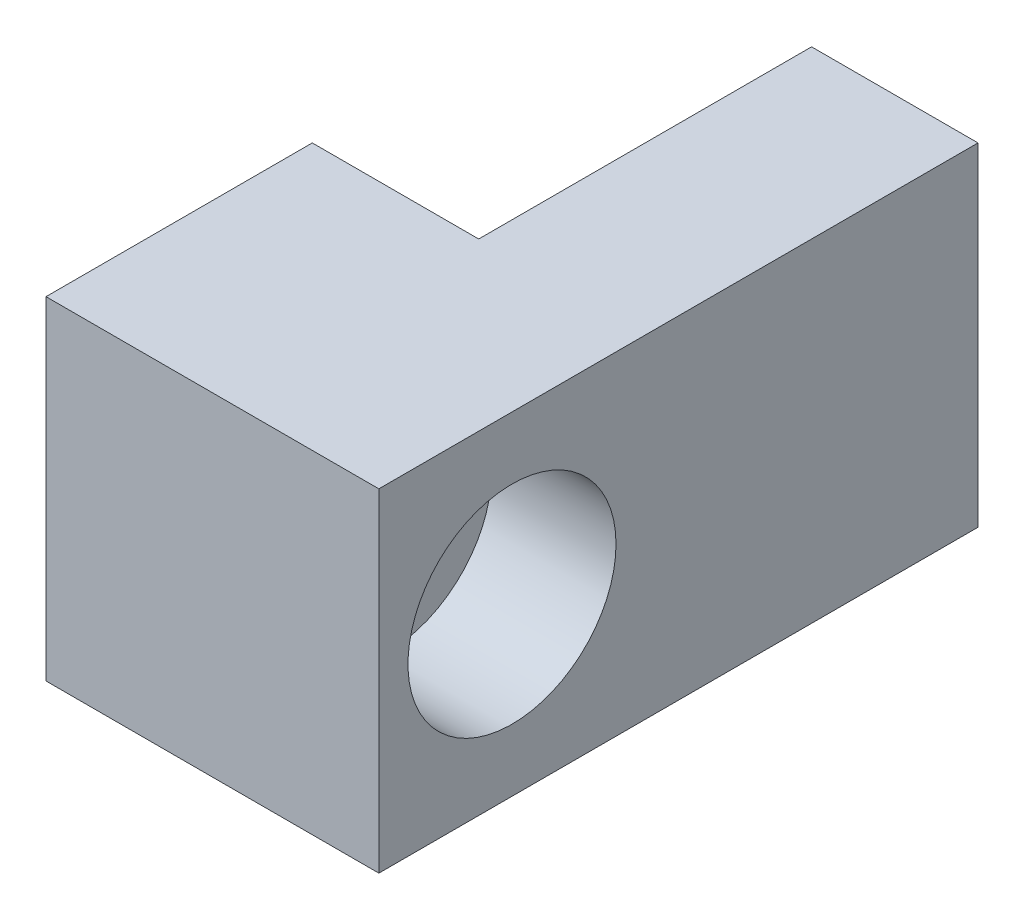
ISO-10303-21;
HEADER;
FILE_DESCRIPTION(('STEP AP214'),'2;1');
FILE_NAME('part.step','',(''),(''),'','','');
FILE_SCHEMA(('AUTOMOTIVE_DESIGN { 1 0 10303 214 1 1 1 1 }'));
ENDSEC;
DATA;
#1=APPLICATION_CONTEXT('core data for automotive mechanical design processes');
#2=APPLICATION_PROTOCOL_DEFINITION('international standard','automotive_design',2000,#1);
#3=PRODUCT_CONTEXT('',#1,'mechanical');
#4=PRODUCT('Part','Part','',(#3));
#5=PRODUCT_RELATED_PRODUCT_CATEGORY('part','',(#4));
#6=PRODUCT_DEFINITION_FORMATION('','',#4);
#7=PRODUCT_DEFINITION_CONTEXT('part definition',#1,'design');
#8=PRODUCT_DEFINITION('design','',#6,#7);
#9=PRODUCT_DEFINITION_SHAPE('','',#8);
#10=(LENGTH_UNIT() NAMED_UNIT(*) SI_UNIT(.MILLI.,.METRE.));
#11=(NAMED_UNIT(*) PLANE_ANGLE_UNIT() SI_UNIT($,.RADIAN.));
#12=(NAMED_UNIT(*) SI_UNIT($,.STERADIAN.) SOLID_ANGLE_UNIT());
#13=UNCERTAINTY_MEASURE_WITH_UNIT(LENGTH_MEASURE(1.E-05),#10,'distance_accuracy_value','');
#14=(GEOMETRIC_REPRESENTATION_CONTEXT(3) GLOBAL_UNCERTAINTY_ASSIGNED_CONTEXT((#13)) GLOBAL_UNIT_ASSIGNED_CONTEXT((#10,
#11,#12)) REPRESENTATION_CONTEXT('',''));
#15=CARTESIAN_POINT('',(0.,0.,0.));
#16=DIRECTION('',(0.,0.,1.));
#17=DIRECTION('',(1.,0.,0.));
#18=AXIS2_PLACEMENT_3D('',#15,#16,#17);
#19=CARTESIAN_POINT('',(3.175,-6.35,6.35));
#20=DIRECTION('',(-1.,0.,0.));
#21=DIRECTION('',(0.,0.,1.));
#22=AXIS2_PLACEMENT_3D('',#19,#20,#21);
#23=PLANE('',#22);
#24=CARTESIAN_POINT('',(3.175,0.,11.43));
#25=DIRECTION('',(1.,0.,0.));
#26=DIRECTION('',(0.,0.,-1.));
#27=AXIS2_PLACEMENT_3D('',#24,#25,#26);
#28=CIRCLE('',#27,3.96875);
#29=CARTESIAN_POINT('',(3.175,0.,7.46125));
#30=VERTEX_POINT('',#29);
#31=EDGE_CURVE('E228',#30,#30,#28,.T.);
#32=ORIENTED_EDGE('',*,*,#31,.F.);
#33=EDGE_LOOP('',(#32));
#34=FACE_BOUND('',#33,.T.);
#35=DIRECTION('',(0.,1.,0.));
#36=VECTOR('',#35,1.);
#37=CARTESIAN_POINT('',(3.175,-6.35,-6.35));
#38=LINE('',#37,#36);
#39=CARTESIAN_POINT('',(3.175,-6.35,-6.35));
#40=VERTEX_POINT('',#39);
#41=CARTESIAN_POINT('',(3.175,6.35,-6.35));
#42=VERTEX_POINT('',#41);
#43=EDGE_CURVE('E116',#40,#42,#38,.T.);
#44=ORIENTED_EDGE('',*,*,#43,.T.);
#45=DIRECTION('',(0.,0.,-1.));
#46=VECTOR('',#45,1.);
#47=CARTESIAN_POINT('',(3.175,6.35,6.35));
#48=LINE('',#47,#46);
#49=CARTESIAN_POINT('',(3.175,6.35,16.51));
#50=VERTEX_POINT('',#49);
#51=EDGE_CURVE('E11',#50,#42,#48,.T.);
#52=ORIENTED_EDGE('',*,*,#51,.F.);
#53=DIRECTION('',(0.,1.,0.));
#54=VECTOR('',#53,1.);
#55=CARTESIAN_POINT('',(3.175,-6.35,16.51));
#56=LINE('',#55,#54);
#57=CARTESIAN_POINT('',(3.175,-6.35,16.51));
#58=VERTEX_POINT('',#57);
#59=EDGE_CURVE('E114',#58,#50,#56,.T.);
#60=ORIENTED_EDGE('',*,*,#59,.F.);
#61=DIRECTION('',(0.,0.,-1.));
#62=VECTOR('',#61,1.);
#63=CARTESIAN_POINT('',(3.175,-6.35,6.35));
#64=LINE('',#63,#62);
#65=EDGE_CURVE('E169',#58,#40,#64,.T.);
#66=ORIENTED_EDGE('',*,*,#65,.T.);
#67=EDGE_LOOP('',(#44,#52,#60,#66));
#68=FACE_BOUND('',#67,.T.);
#69=ADVANCED_FACE('F39',(#34,#68),#23,.F.);
#70=CARTESIAN_POINT('',(-3.175,6.35,6.35));
#71=DIRECTION('',(0.,-1.,0.));
#72=DIRECTION('',(0.,0.,-1.));
#73=AXIS2_PLACEMENT_3D('',#70,#71,#72);
#74=PLANE('',#73);
#75=DIRECTION('',(-1.,0.,0.));
#76=VECTOR('',#75,1.);
#77=CARTESIAN_POINT('',(-3.175,6.35,-6.35));
#78=LINE('',#77,#76);
#79=CARTESIAN_POINT('',(-3.175,6.35,-6.35));
#80=VERTEX_POINT('',#79);
#81=EDGE_CURVE('E172',#42,#80,#78,.T.);
#82=ORIENTED_EDGE('',*,*,#81,.T.);
#83=DIRECTION('',(0.,0.,-1.));
#84=VECTOR('',#83,1.);
#85=CARTESIAN_POINT('',(-3.175,6.35,6.35));
#86=LINE('',#85,#84);
#87=CARTESIAN_POINT('',(-3.175,6.35,6.35));
#88=VERTEX_POINT('',#87);
#89=EDGE_CURVE('E48',#88,#80,#86,.T.);
#90=ORIENTED_EDGE('',*,*,#89,.F.);
#91=DIRECTION('',(-1.,0.,0.));
#92=VECTOR('',#91,1.);
#93=CARTESIAN_POINT('',(3.175,6.35,6.35));
#94=LINE('',#93,#92);
#95=CARTESIAN_POINT('',(-9.525,6.35,6.35));
#96=VERTEX_POINT('',#95);
#97=EDGE_CURVE('E147',#88,#96,#94,.T.);
#98=ORIENTED_EDGE('',*,*,#97,.T.);
#99=DIRECTION('',(0.,0.,-1.));
#100=VECTOR('',#99,1.);
#101=CARTESIAN_POINT('',(-9.525,6.35,16.51));
#102=LINE('',#101,#100);
#103=CARTESIAN_POINT('',(-9.525,6.35,16.51));
#104=VERTEX_POINT('',#103);
#105=EDGE_CURVE('E121',#104,#96,#102,.T.);
#106=ORIENTED_EDGE('',*,*,#105,.F.);
#107=DIRECTION('',(-1.,0.,0.));
#108=VECTOR('',#107,1.);
#109=CARTESIAN_POINT('',(3.175,6.35,16.51));
#110=LINE('',#109,#108);
#111=EDGE_CURVE('E118',#50,#104,#110,.T.);
#112=ORIENTED_EDGE('',*,*,#111,.F.);
#113=ORIENTED_EDGE('',*,*,#51,.T.);
#114=EDGE_LOOP('',(#82,#90,#98,#106,#112,#113));
#115=FACE_BOUND('',#114,.T.);
#116=ADVANCED_FACE('F119',(#115),#74,.F.);
#117=CARTESIAN_POINT('',(-3.175,4.7625,6.35));
#118=DIRECTION('',(1.,0.,0.));
#119=DIRECTION('',(0.,0.,-1.));
#120=AXIS2_PLACEMENT_3D('',#117,#118,#119);
#121=PLANE('',#120);
#122=DIRECTION('',(0.,-1.,0.));
#123=VECTOR('',#122,1.);
#124=CARTESIAN_POINT('',(-3.175,4.7625,-6.35));
#125=LINE('',#124,#123);
#126=CARTESIAN_POINT('',(-3.175,4.7625,-6.35));
#127=VERTEX_POINT('',#126);
#128=EDGE_CURVE('E175',#80,#127,#125,.T.);
#129=ORIENTED_EDGE('',*,*,#128,.T.);
#130=DIRECTION('',(0.,0.,-1.));
#131=VECTOR('',#130,1.);
#132=CARTESIAN_POINT('',(-3.175,4.7625,6.35));
#133=LINE('',#132,#131);
#134=CARTESIAN_POINT('',(-3.175,4.7625,6.35));
#135=VERTEX_POINT('',#134);
#136=EDGE_CURVE('E192',#135,#127,#133,.T.);
#137=ORIENTED_EDGE('',*,*,#136,.F.);
#138=DIRECTION('',(0.,-1.,0.));
#139=VECTOR('',#138,1.);
#140=CARTESIAN_POINT('',(-3.175,4.7625,6.35));
#141=LINE('',#140,#139);
#142=EDGE_CURVE('E157',#88,#135,#141,.T.);
#143=ORIENTED_EDGE('',*,*,#142,.F.);
#144=ORIENTED_EDGE('',*,*,#89,.T.);
#145=EDGE_LOOP('',(#129,#137,#143,#144));
#146=FACE_BOUND('',#145,.T.);
#147=ADVANCED_FACE('F198',(#146),#121,.F.);
#148=CARTESIAN_POINT('',(-3.175,0.,6.35));
#149=DIRECTION('',(0.,0.,-1.));
#150=DIRECTION('',(-1.,0.,0.));
#151=AXIS2_PLACEMENT_3D('',#148,#149,#150);
#152=CYLINDRICAL_SURFACE('',#151,4.7625);
#153=CARTESIAN_POINT('',(-3.175,0.,-6.35));
#154=DIRECTION('',(0.,0.,-1.));
#155=DIRECTION('',(1.,0.,0.));
#156=AXIS2_PLACEMENT_3D('',#153,#154,#155);
#157=CIRCLE('',#156,4.7625);
#158=CARTESIAN_POINT('',(-3.175,-4.7625,-6.35));
#159=VERTEX_POINT('',#158);
#160=EDGE_CURVE('E178',#127,#159,#157,.T.);
#161=ORIENTED_EDGE('',*,*,#160,.T.);
#162=DIRECTION('',(0.,0.,-1.));
#163=VECTOR('',#162,1.);
#164=CARTESIAN_POINT('',(-3.175,-4.7625,6.35));
#165=LINE('',#164,#163);
#166=CARTESIAN_POINT('',(-3.175,-4.7625,6.35));
#167=VERTEX_POINT('',#166);
#168=EDGE_CURVE('E56',#167,#159,#165,.T.);
#169=ORIENTED_EDGE('',*,*,#168,.F.);
#170=CARTESIAN_POINT('',(-3.175,0.,6.35));
#171=DIRECTION('',(0.,0.,-1.));
#172=DIRECTION('',(1.,0.,0.));
#173=AXIS2_PLACEMENT_3D('',#170,#171,#172);
#174=CIRCLE('',#173,4.7625);
#175=EDGE_CURVE('E161',#135,#167,#174,.T.);
#176=ORIENTED_EDGE('',*,*,#175,.F.);
#177=ORIENTED_EDGE('',*,*,#136,.T.);
#178=EDGE_LOOP('',(#161,#169,#176,#177));
#179=FACE_BOUND('',#178,.T.);
#180=ADVANCED_FACE('F203',(#179),#152,.F.);
#181=CARTESIAN_POINT('',(-3.175,-6.35,6.35));
#182=DIRECTION('',(1.,0.,0.));
#183=DIRECTION('',(0.,0.,-1.));
#184=AXIS2_PLACEMENT_3D('',#181,#182,#183);
#185=PLANE('',#184);
#186=DIRECTION('',(0.,-1.,0.));
#187=VECTOR('',#186,1.);
#188=CARTESIAN_POINT('',(-3.175,-6.35,-6.35));
#189=LINE('',#188,#187);
#190=CARTESIAN_POINT('',(-3.175,-6.35,-6.35));
#191=VERTEX_POINT('',#190);
#192=EDGE_CURVE('E79',#159,#191,#189,.T.);
#193=ORIENTED_EDGE('',*,*,#192,.T.);
#194=DIRECTION('',(0.,0.,-1.));
#195=VECTOR('',#194,1.);
#196=CARTESIAN_POINT('',(-3.175,-6.35,6.35));
#197=LINE('',#196,#195);
#198=CARTESIAN_POINT('',(-3.175,-6.35,6.35));
#199=VERTEX_POINT('',#198);
#200=EDGE_CURVE('E187',#199,#191,#197,.T.);
#201=ORIENTED_EDGE('',*,*,#200,.F.);
#202=DIRECTION('',(0.,-1.,0.));
#203=VECTOR('',#202,1.);
#204=CARTESIAN_POINT('',(-3.175,-6.35,6.35));
#205=LINE('',#204,#203);
#206=EDGE_CURVE('E165',#167,#199,#205,.T.);
#207=ORIENTED_EDGE('',*,*,#206,.F.);
#208=ORIENTED_EDGE('',*,*,#168,.T.);
#209=EDGE_LOOP('',(#193,#201,#207,#208));
#210=FACE_BOUND('',#209,.T.);
#211=ADVANCED_FACE('F204',(#210),#185,.F.);
#212=CARTESIAN_POINT('',(-3.175,-6.35,6.35));
#213=DIRECTION('',(0.,1.,0.));
#214=DIRECTION('',(0.,0.,1.));
#215=AXIS2_PLACEMENT_3D('',#212,#213,#214);
#216=PLANE('',#215);
#217=DIRECTION('',(1.,0.,0.));
#218=VECTOR('',#217,1.);
#219=CARTESIAN_POINT('',(-3.175,-6.35,-6.35));
#220=LINE('',#219,#218);
#221=EDGE_CURVE('E85',#191,#40,#220,.T.);
#222=ORIENTED_EDGE('',*,*,#221,.T.);
#223=ORIENTED_EDGE('',*,*,#65,.F.);
#224=DIRECTION('',(1.,0.,0.));
#225=VECTOR('',#224,1.);
#226=CARTESIAN_POINT('',(3.175,-6.35,16.51));
#227=LINE('',#226,#225);
#228=CARTESIAN_POINT('',(-9.525,-6.35,16.51));
#229=VERTEX_POINT('',#228);
#230=EDGE_CURVE('E130',#229,#58,#227,.T.);
#231=ORIENTED_EDGE('',*,*,#230,.F.);
#232=DIRECTION('',(0.,0.,-1.));
#233=VECTOR('',#232,1.);
#234=CARTESIAN_POINT('',(-9.525,-6.35,16.51));
#235=LINE('',#234,#233);
#236=CARTESIAN_POINT('',(-9.525,-6.35,6.35));
#237=VERTEX_POINT('',#236);
#238=EDGE_CURVE('E146',#229,#237,#235,.T.);
#239=ORIENTED_EDGE('',*,*,#238,.T.);
#240=DIRECTION('',(1.,0.,0.));
#241=VECTOR('',#240,1.);
#242=CARTESIAN_POINT('',(3.175,-6.35,6.35));
#243=LINE('',#242,#241);
#244=EDGE_CURVE('E132',#237,#199,#243,.T.);
#245=ORIENTED_EDGE('',*,*,#244,.T.);
#246=ORIENTED_EDGE('',*,*,#200,.T.);
#247=EDGE_LOOP('',(#222,#223,#231,#239,#245,#246));
#248=FACE_BOUND('',#247,.T.);
#249=ADVANCED_FACE('F212',(#248),#216,.F.);
#250=CARTESIAN_POINT('',(-3.175,0.,-6.35));
#251=DIRECTION('',(0.,0.,1.));
#252=DIRECTION('',(1.,0.,0.));
#253=AXIS2_PLACEMENT_3D('',#250,#251,#252);
#254=PLANE('',#253);
#255=ORIENTED_EDGE('',*,*,#43,.F.);
#256=ORIENTED_EDGE('',*,*,#221,.F.);
#257=ORIENTED_EDGE('',*,*,#192,.F.);
#258=ORIENTED_EDGE('',*,*,#160,.F.);
#259=ORIENTED_EDGE('',*,*,#128,.F.);
#260=ORIENTED_EDGE('',*,*,#81,.F.);
#261=EDGE_LOOP('',(#255,#256,#257,#258,#259,#260));
#262=FACE_BOUND('',#261,.T.);
#263=ADVANCED_FACE('F202',(#262),#254,.F.);
#264=CARTESIAN_POINT('',(0.,0.,6.35));
#265=DIRECTION('',(0.,0.,1.));
#266=DIRECTION('',(1.,0.,0.));
#267=AXIS2_PLACEMENT_3D('',#264,#265,#266);
#268=PLANE('',#267);
#269=ORIENTED_EDGE('',*,*,#97,.F.);
#270=ORIENTED_EDGE('',*,*,#142,.T.);
#271=ORIENTED_EDGE('',*,*,#175,.T.);
#272=ORIENTED_EDGE('',*,*,#206,.T.);
#273=ORIENTED_EDGE('',*,*,#244,.F.);
#274=DIRECTION('',(0.,-1.,0.));
#275=VECTOR('',#274,1.);
#276=CARTESIAN_POINT('',(-9.525,-6.35,6.35));
#277=LINE('',#276,#275);
#278=EDGE_CURVE('E136',#96,#237,#277,.T.);
#279=ORIENTED_EDGE('',*,*,#278,.F.);
#280=EDGE_LOOP('',(#269,#270,#271,#272,#273,#279));
#281=FACE_BOUND('',#280,.T.);
#282=ADVANCED_FACE('F207',(#281),#268,.F.);
#283=CARTESIAN_POINT('',(-9.525,-6.35,16.51));
#284=DIRECTION('',(1.,0.,0.));
#285=DIRECTION('',(0.,0.,-1.));
#286=AXIS2_PLACEMENT_3D('',#283,#284,#285);
#287=PLANE('',#286);
#288=CARTESIAN_POINT('',(-9.525,0.,11.43));
#289=DIRECTION('',(1.,0.,0.));
#290=DIRECTION('',(0.,0.,-1.));
#291=AXIS2_PLACEMENT_3D('',#288,#289,#290);
#292=CIRCLE('',#291,1.89865);
#293=CARTESIAN_POINT('',(-9.525,0.,9.53135));
#294=VERTEX_POINT('',#293);
#295=EDGE_CURVE('E139',#294,#294,#292,.T.);
#296=ORIENTED_EDGE('',*,*,#295,.T.);
#297=EDGE_LOOP('',(#296));
#298=FACE_BOUND('',#297,.T.);
#299=ORIENTED_EDGE('',*,*,#278,.T.);
#300=ORIENTED_EDGE('',*,*,#238,.F.);
#301=DIRECTION('',(0.,-1.,0.));
#302=VECTOR('',#301,1.);
#303=CARTESIAN_POINT('',(-9.525,-6.35,16.51));
#304=LINE('',#303,#302);
#305=EDGE_CURVE('E125',#104,#229,#304,.T.);
#306=ORIENTED_EDGE('',*,*,#305,.F.);
#307=ORIENTED_EDGE('',*,*,#105,.T.);
#308=EDGE_LOOP('',(#299,#300,#306,#307));
#309=FACE_BOUND('',#308,.T.);
#310=ADVANCED_FACE('F210',(#298,#309),#287,.F.);
#311=CARTESIAN_POINT('',(0.,0.,16.51));
#312=DIRECTION('',(0.,0.,1.));
#313=DIRECTION('',(1.,0.,0.));
#314=AXIS2_PLACEMENT_3D('',#311,#312,#313);
#315=PLANE('',#314);
#316=ORIENTED_EDGE('',*,*,#59,.T.);
#317=ORIENTED_EDGE('',*,*,#111,.T.);
#318=ORIENTED_EDGE('',*,*,#305,.T.);
#319=ORIENTED_EDGE('',*,*,#230,.T.);
#320=EDGE_LOOP('',(#316,#317,#318,#319));
#321=FACE_BOUND('',#320,.T.);
#322=ADVANCED_FACE('F128',(#321),#315,.T.);
#323=CARTESIAN_POINT('',(3.175,0.,11.43));
#324=DIRECTION('',(1.,0.,0.));
#325=DIRECTION('',(0.,0.,-1.));
#326=AXIS2_PLACEMENT_3D('',#323,#324,#325);
#327=CYLINDRICAL_SURFACE('',#326,1.89865);
#328=ORIENTED_EDGE('',*,*,#295,.F.);
#329=EDGE_LOOP('',(#328));
#330=FACE_BOUND('',#329,.T.);
#331=CARTESIAN_POINT('',(-1.5748,0.,11.43));
#332=DIRECTION('',(1.,0.,0.));
#333=DIRECTION('',(0.,0.,-1.));
#334=AXIS2_PLACEMENT_3D('',#331,#332,#333);
#335=CIRCLE('',#334,1.89865);
#336=CARTESIAN_POINT('',(-1.5748,0.,9.53135));
#337=VERTEX_POINT('',#336);
#338=EDGE_CURVE('E235',#337,#337,#335,.T.);
#339=ORIENTED_EDGE('',*,*,#338,.T.);
#340=EDGE_LOOP('',(#339));
#341=FACE_BOUND('',#340,.T.);
#342=ADVANCED_FACE('F246',(#330,#341),#327,.F.);
#343=CARTESIAN_POINT('',(-1.5748,1.89865,11.43));
#344=DIRECTION('',(-1.,0.,0.));
#345=DIRECTION('',(0.,0.,1.));
#346=AXIS2_PLACEMENT_3D('',#343,#344,#345);
#347=PLANE('',#346);
#348=ORIENTED_EDGE('',*,*,#338,.F.);
#349=EDGE_LOOP('',(#348));
#350=FACE_BOUND('',#349,.T.);
#351=CARTESIAN_POINT('',(-1.5748,0.,11.43));
#352=DIRECTION('',(1.,0.,0.));
#353=DIRECTION('',(0.,0.,-1.));
#354=AXIS2_PLACEMENT_3D('',#351,#352,#353);
#355=CIRCLE('',#354,3.96875);
#356=CARTESIAN_POINT('',(-1.5748,0.,7.46125));
#357=VERTEX_POINT('',#356);
#358=EDGE_CURVE('E231',#357,#357,#355,.T.);
#359=ORIENTED_EDGE('',*,*,#358,.T.);
#360=EDGE_LOOP('',(#359));
#361=FACE_BOUND('',#360,.T.);
#362=ADVANCED_FACE('F248',(#350,#361),#347,.F.);
#363=CARTESIAN_POINT('',(3.175,0.,11.43));
#364=DIRECTION('',(1.,0.,0.));
#365=DIRECTION('',(0.,0.,-1.));
#366=AXIS2_PLACEMENT_3D('',#363,#364,#365);
#367=CYLINDRICAL_SURFACE('',#366,3.96875);
#368=ORIENTED_EDGE('',*,*,#358,.F.);
#369=EDGE_LOOP('',(#368));
#370=FACE_BOUND('',#369,.T.);
#371=ORIENTED_EDGE('',*,*,#31,.T.);
#372=EDGE_LOOP('',(#371));
#373=FACE_BOUND('',#372,.T.);
#374=ADVANCED_FACE('F254',(#370,#373),#367,.F.);
#375=CLOSED_SHELL('',(#69,#116,#147,#180,#211,#249,#263,#282,#310,#322,#342,#362,#374));
#376=MANIFOLD_SOLID_BREP('B2',#375);
#377=ADVANCED_BREP_SHAPE_REPRESENTATION('',(#18,#376),#14);
#378=SHAPE_DEFINITION_REPRESENTATION(#9,#377);
ENDSEC;
END-ISO-10303-21;
